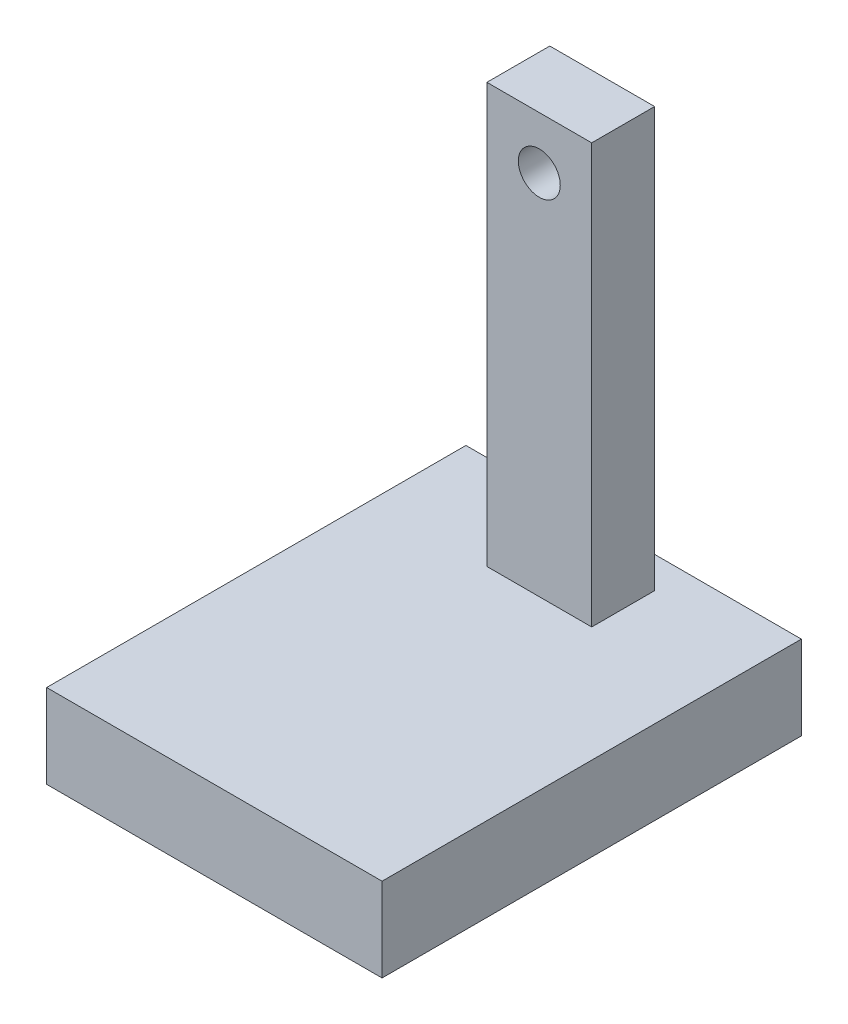
ISO-10303-21;
HEADER;
FILE_DESCRIPTION(('STEP AP214'),'2;1');
FILE_NAME('part.step','',(''),(''),'','','');
FILE_SCHEMA(('AUTOMOTIVE_DESIGN { 1 0 10303 214 1 1 1 1 }'));
ENDSEC;
DATA;
#1=APPLICATION_CONTEXT('core data for automotive mechanical design processes');
#2=APPLICATION_PROTOCOL_DEFINITION('international standard','automotive_design',2000,#1);
#3=PRODUCT_CONTEXT('',#1,'mechanical');
#4=PRODUCT('Part','Part','',(#3));
#5=PRODUCT_RELATED_PRODUCT_CATEGORY('part','',(#4));
#6=PRODUCT_DEFINITION_FORMATION('','',#4);
#7=PRODUCT_DEFINITION_CONTEXT('part definition',#1,'design');
#8=PRODUCT_DEFINITION('design','',#6,#7);
#9=PRODUCT_DEFINITION_SHAPE('','',#8);
#10=(LENGTH_UNIT() NAMED_UNIT(*) SI_UNIT(.MILLI.,.METRE.));
#11=(NAMED_UNIT(*) PLANE_ANGLE_UNIT() SI_UNIT($,.RADIAN.));
#12=(NAMED_UNIT(*) SI_UNIT($,.STERADIAN.) SOLID_ANGLE_UNIT());
#13=UNCERTAINTY_MEASURE_WITH_UNIT(LENGTH_MEASURE(1.E-05),#10,'distance_accuracy_value','');
#14=(GEOMETRIC_REPRESENTATION_CONTEXT(3) GLOBAL_UNCERTAINTY_ASSIGNED_CONTEXT((#13)) GLOBAL_UNIT_ASSIGNED_CONTEXT((#10,
#11,#12)) REPRESENTATION_CONTEXT('',''));
#15=CARTESIAN_POINT('',(0.,0.,0.));
#16=DIRECTION('',(0.,0.,1.));
#17=DIRECTION('',(1.,0.,0.));
#18=AXIS2_PLACEMENT_3D('',#15,#16,#17);
#19=CARTESIAN_POINT('',(40.,20.,-50.));
#20=DIRECTION('',(-1.,0.,0.));
#21=DIRECTION('',(0.,0.,1.));
#22=AXIS2_PLACEMENT_3D('',#19,#20,#21);
#23=PLANE('',#22);
#24=DIRECTION('',(0.,0.,-1.));
#25=VECTOR('',#24,1.);
#26=CARTESIAN_POINT('',(40.,0.,-50.));
#27=LINE('',#26,#25);
#28=CARTESIAN_POINT('',(40.,0.,50.));
#29=VERTEX_POINT('',#28);
#30=CARTESIAN_POINT('',(40.,0.,-50.));
#31=VERTEX_POINT('',#30);
#32=EDGE_CURVE('E363',#29,#31,#27,.T.);
#33=ORIENTED_EDGE('',*,*,#32,.T.);
#34=DIRECTION('',(0.,-1.,0.));
#35=VECTOR('',#34,1.);
#36=CARTESIAN_POINT('',(40.,20.,-50.));
#37=LINE('',#36,#35);
#38=CARTESIAN_POINT('',(40.,20.,-50.));
#39=VERTEX_POINT('',#38);
#40=EDGE_CURVE('E11',#39,#31,#37,.T.);
#41=ORIENTED_EDGE('',*,*,#40,.F.);
#42=DIRECTION('',(0.,0.,-1.));
#43=VECTOR('',#42,1.);
#44=CARTESIAN_POINT('',(40.,20.,-50.));
#45=LINE('',#44,#43);
#46=CARTESIAN_POINT('',(40.,20.,50.));
#47=VERTEX_POINT('',#46);
#48=EDGE_CURVE('E364',#47,#39,#45,.T.);
#49=ORIENTED_EDGE('',*,*,#48,.F.);
#50=DIRECTION('',(0.,-1.,0.));
#51=VECTOR('',#50,1.);
#52=CARTESIAN_POINT('',(40.,20.,50.));
#53=LINE('',#52,#51);
#54=EDGE_CURVE('E374',#47,#29,#53,.T.);
#55=ORIENTED_EDGE('',*,*,#54,.T.);
#56=EDGE_LOOP('',(#33,#41,#49,#55));
#57=FACE_BOUND('',#56,.T.);
#58=ADVANCED_FACE('F39',(#57),#23,.F.);
#59=CARTESIAN_POINT('',(-40.,20.,-50.));
#60=DIRECTION('',(0.,0.,1.));
#61=DIRECTION('',(1.,0.,0.));
#62=AXIS2_PLACEMENT_3D('',#59,#60,#61);
#63=PLANE('',#62);
#64=DIRECTION('',(-1.,0.,0.));
#65=VECTOR('',#64,1.);
#66=CARTESIAN_POINT('',(-40.,0.,-50.));
#67=LINE('',#66,#65);
#68=CARTESIAN_POINT('',(-40.,0.,-50.));
#69=VERTEX_POINT('',#68);
#70=EDGE_CURVE('E377',#31,#69,#67,.T.);
#71=ORIENTED_EDGE('',*,*,#70,.T.);
#72=DIRECTION('',(0.,-1.,0.));
#73=VECTOR('',#72,1.);
#74=CARTESIAN_POINT('',(-40.,20.,-50.));
#75=LINE('',#74,#73);
#76=CARTESIAN_POINT('',(-40.,20.,-50.));
#77=VERTEX_POINT('',#76);
#78=EDGE_CURVE('E46',#77,#69,#75,.T.);
#79=ORIENTED_EDGE('',*,*,#78,.F.);
#80=DIRECTION('',(-1.,0.,0.));
#81=VECTOR('',#80,1.);
#82=CARTESIAN_POINT('',(-40.,20.,-50.));
#83=LINE('',#82,#81);
#84=EDGE_CURVE('E367',#39,#77,#83,.T.);
#85=ORIENTED_EDGE('',*,*,#84,.F.);
#86=ORIENTED_EDGE('',*,*,#40,.T.);
#87=EDGE_LOOP('',(#71,#79,#85,#86));
#88=FACE_BOUND('',#87,.T.);
#89=ADVANCED_FACE('F407',(#88),#63,.F.);
#90=CARTESIAN_POINT('',(-40.,20.,-50.));
#91=DIRECTION('',(1.,0.,0.));
#92=DIRECTION('',(0.,0.,-1.));
#93=AXIS2_PLACEMENT_3D('',#90,#91,#92);
#94=PLANE('',#93);
#95=DIRECTION('',(0.,0.,1.));
#96=VECTOR('',#95,1.);
#97=CARTESIAN_POINT('',(-40.,0.,-50.));
#98=LINE('',#97,#96);
#99=CARTESIAN_POINT('',(-40.,0.,50.));
#100=VERTEX_POINT('',#99);
#101=EDGE_CURVE('E379',#69,#100,#98,.T.);
#102=ORIENTED_EDGE('',*,*,#101,.T.);
#103=DIRECTION('',(0.,-1.,0.));
#104=VECTOR('',#103,1.);
#105=CARTESIAN_POINT('',(-40.,20.,50.));
#106=LINE('',#105,#104);
#107=CARTESIAN_POINT('',(-40.,20.,50.));
#108=VERTEX_POINT('',#107);
#109=EDGE_CURVE('E384',#108,#100,#106,.T.);
#110=ORIENTED_EDGE('',*,*,#109,.F.);
#111=DIRECTION('',(0.,0.,1.));
#112=VECTOR('',#111,1.);
#113=CARTESIAN_POINT('',(-40.,20.,-50.));
#114=LINE('',#113,#112);
#115=EDGE_CURVE('E370',#77,#108,#114,.T.);
#116=ORIENTED_EDGE('',*,*,#115,.F.);
#117=ORIENTED_EDGE('',*,*,#78,.T.);
#118=EDGE_LOOP('',(#102,#110,#116,#117));
#119=FACE_BOUND('',#118,.T.);
#120=ADVANCED_FACE('F391',(#119),#94,.F.);
#121=CARTESIAN_POINT('',(-40.,20.,50.));
#122=DIRECTION('',(0.,0.,-1.));
#123=DIRECTION('',(-1.,0.,0.));
#124=AXIS2_PLACEMENT_3D('',#121,#122,#123);
#125=PLANE('',#124);
#126=DIRECTION('',(1.,0.,0.));
#127=VECTOR('',#126,1.);
#128=CARTESIAN_POINT('',(-40.,0.,50.));
#129=LINE('',#128,#127);
#130=EDGE_CURVE('E368',#100,#29,#129,.T.);
#131=ORIENTED_EDGE('',*,*,#130,.T.);
#132=ORIENTED_EDGE('',*,*,#54,.F.);
#133=DIRECTION('',(1.,0.,0.));
#134=VECTOR('',#133,1.);
#135=CARTESIAN_POINT('',(-40.,20.,50.));
#136=LINE('',#135,#134);
#137=EDGE_CURVE('E372',#108,#47,#136,.T.);
#138=ORIENTED_EDGE('',*,*,#137,.F.);
#139=ORIENTED_EDGE('',*,*,#109,.T.);
#140=EDGE_LOOP('',(#131,#132,#138,#139));
#141=FACE_BOUND('',#140,.T.);
#142=ADVANCED_FACE('F400',(#141),#125,.F.);
#143=CARTESIAN_POINT('',(0.,20.,0.));
#144=DIRECTION('',(0.,1.,0.));
#145=DIRECTION('',(0.,0.,1.));
#146=AXIS2_PLACEMENT_3D('',#143,#144,#145);
#147=PLANE('',#146);
#148=DIRECTION('',(0.,0.,1.));
#149=VECTOR('',#148,1.);
#150=CARTESIAN_POINT('',(12.5,20.,0.));
#151=LINE('',#150,#149);
#152=CARTESIAN_POINT('',(12.5,20.,-42.5));
#153=VERTEX_POINT('',#152);
#154=CARTESIAN_POINT('',(12.5,20.,-27.5));
#155=VERTEX_POINT('',#154);
#156=EDGE_CURVE('E331',#153,#155,#151,.T.);
#157=ORIENTED_EDGE('',*,*,#156,.T.);
#158=DIRECTION('',(1.,0.,0.));
#159=VECTOR('',#158,1.);
#160=CARTESIAN_POINT('',(0.,20.,-27.5));
#161=LINE('',#160,#159);
#162=CARTESIAN_POINT('',(-12.5,20.,-27.5));
#163=VERTEX_POINT('',#162);
#164=EDGE_CURVE('E338',#163,#155,#161,.T.);
#165=ORIENTED_EDGE('',*,*,#164,.F.);
#166=DIRECTION('',(0.,0.,1.));
#167=VECTOR('',#166,1.);
#168=CARTESIAN_POINT('',(-12.5,20.,0.));
#169=LINE('',#168,#167);
#170=CARTESIAN_POINT('',(-12.5,20.,-42.5));
#171=VERTEX_POINT('',#170);
#172=EDGE_CURVE('E351',#171,#163,#169,.T.);
#173=ORIENTED_EDGE('',*,*,#172,.F.);
#174=DIRECTION('',(1.,0.,0.));
#175=VECTOR('',#174,1.);
#176=CARTESIAN_POINT('',(0.,20.,-42.5));
#177=LINE('',#176,#175);
#178=EDGE_CURVE('E348',#171,#153,#177,.T.);
#179=ORIENTED_EDGE('',*,*,#178,.T.);
#180=EDGE_LOOP('',(#157,#165,#173,#179));
#181=FACE_BOUND('',#180,.T.);
#182=ORIENTED_EDGE('',*,*,#48,.T.);
#183=ORIENTED_EDGE('',*,*,#84,.T.);
#184=ORIENTED_EDGE('',*,*,#115,.T.);
#185=ORIENTED_EDGE('',*,*,#137,.T.);
#186=EDGE_LOOP('',(#182,#183,#184,#185));
#187=FACE_BOUND('',#186,.T.);
#188=ADVANCED_FACE('F406',(#181,#187),#147,.T.);
#189=CARTESIAN_POINT('',(0.,0.,0.));
#190=DIRECTION('',(0.,1.,0.));
#191=DIRECTION('',(0.,0.,1.));
#192=AXIS2_PLACEMENT_3D('',#189,#190,#191);
#193=PLANE('',#192);
#194=DIRECTION('',(1.,0.,0.));
#195=VECTOR('',#194,1.);
#196=CARTESIAN_POINT('',(0.,0.,-25.));
#197=LINE('',#196,#195);
#198=CARTESIAN_POINT('',(-35.,0.,-25.));
#199=VERTEX_POINT('',#198);
#200=CARTESIAN_POINT('',(-15.,0.,-25.));
#201=VERTEX_POINT('',#200);
#202=EDGE_CURVE('E53',#199,#201,#197,.T.);
#203=ORIENTED_EDGE('',*,*,#202,.T.);
#204=DIRECTION('',(0.,0.,-1.));
#205=VECTOR('',#204,1.);
#206=CARTESIAN_POINT('',(-15.,0.,0.));
#207=LINE('',#206,#205);
#208=CARTESIAN_POINT('',(-15.,0.,-45.));
#209=VERTEX_POINT('',#208);
#210=EDGE_CURVE('E203',#201,#209,#207,.T.);
#211=ORIENTED_EDGE('',*,*,#210,.T.);
#212=DIRECTION('',(1.,0.,0.));
#213=VECTOR('',#212,1.);
#214=CARTESIAN_POINT('',(0.,0.,-45.));
#215=LINE('',#214,#213);
#216=CARTESIAN_POINT('',(-35.,0.,-45.));
#217=VERTEX_POINT('',#216);
#218=EDGE_CURVE('E216',#217,#209,#215,.T.);
#219=ORIENTED_EDGE('',*,*,#218,.F.);
#220=DIRECTION('',(0.,0.,-1.));
#221=VECTOR('',#220,1.);
#222=CARTESIAN_POINT('',(-35.,0.,0.));
#223=LINE('',#222,#221);
#224=EDGE_CURVE('E58',#199,#217,#223,.T.);
#225=ORIENTED_EDGE('',*,*,#224,.F.);
#226=EDGE_LOOP('',(#203,#211,#219,#225));
#227=FACE_BOUND('',#226,.T.);
#228=DIRECTION('',(-1.,0.,0.));
#229=VECTOR('',#228,1.);
#230=CARTESIAN_POINT('',(0.,0.,-25.));
#231=LINE('',#230,#229);
#232=CARTESIAN_POINT('',(35.,0.,-25.));
#233=VERTEX_POINT('',#232);
#234=CARTESIAN_POINT('',(15.,0.,-25.));
#235=VERTEX_POINT('',#234);
#236=EDGE_CURVE('E250',#233,#235,#231,.T.);
#237=ORIENTED_EDGE('',*,*,#236,.F.);
#238=DIRECTION('',(0.,0.,-1.));
#239=VECTOR('',#238,1.);
#240=CARTESIAN_POINT('',(35.,0.,0.));
#241=LINE('',#240,#239);
#242=CARTESIAN_POINT('',(35.,0.,-45.));
#243=VERTEX_POINT('',#242);
#244=EDGE_CURVE('E206',#233,#243,#241,.T.);
#245=ORIENTED_EDGE('',*,*,#244,.T.);
#246=DIRECTION('',(-1.,0.,0.));
#247=VECTOR('',#246,1.);
#248=CARTESIAN_POINT('',(0.,0.,-45.));
#249=LINE('',#248,#247);
#250=CARTESIAN_POINT('',(15.,0.,-45.));
#251=VERTEX_POINT('',#250);
#252=EDGE_CURVE('E240',#243,#251,#249,.T.);
#253=ORIENTED_EDGE('',*,*,#252,.T.);
#254=DIRECTION('',(0.,0.,-1.));
#255=VECTOR('',#254,1.);
#256=CARTESIAN_POINT('',(15.,0.,0.));
#257=LINE('',#256,#255);
#258=EDGE_CURVE('E252',#235,#251,#257,.T.);
#259=ORIENTED_EDGE('',*,*,#258,.F.);
#260=EDGE_LOOP('',(#237,#245,#253,#259));
#261=FACE_BOUND('',#260,.T.);
#262=DIRECTION('',(-1.,0.,0.));
#263=VECTOR('',#262,1.);
#264=CARTESIAN_POINT('',(0.,0.,45.));
#265=LINE('',#264,#263);
#266=CARTESIAN_POINT('',(35.,0.,45.));
#267=VERTEX_POINT('',#266);
#268=CARTESIAN_POINT('',(15.,0.,45.));
#269=VERTEX_POINT('',#268);
#270=EDGE_CURVE('E280',#267,#269,#265,.T.);
#271=ORIENTED_EDGE('',*,*,#270,.F.);
#272=DIRECTION('',(0.,0.,-1.));
#273=VECTOR('',#272,1.);
#274=CARTESIAN_POINT('',(35.,0.,0.));
#275=LINE('',#274,#273);
#276=CARTESIAN_POINT('',(35.,0.,25.));
#277=VERTEX_POINT('',#276);
#278=EDGE_CURVE('E265',#267,#277,#275,.T.);
#279=ORIENTED_EDGE('',*,*,#278,.T.);
#280=DIRECTION('',(-1.,0.,0.));
#281=VECTOR('',#280,1.);
#282=CARTESIAN_POINT('',(0.,0.,25.));
#283=LINE('',#282,#281);
#284=CARTESIAN_POINT('',(15.,0.,25.));
#285=VERTEX_POINT('',#284);
#286=EDGE_CURVE('E270',#277,#285,#283,.T.);
#287=ORIENTED_EDGE('',*,*,#286,.T.);
#288=DIRECTION('',(0.,0.,-1.));
#289=VECTOR('',#288,1.);
#290=CARTESIAN_POINT('',(15.,0.,0.));
#291=LINE('',#290,#289);
#292=EDGE_CURVE('E282',#269,#285,#291,.T.);
#293=ORIENTED_EDGE('',*,*,#292,.F.);
#294=EDGE_LOOP('',(#271,#279,#287,#293));
#295=FACE_BOUND('',#294,.T.);
#296=DIRECTION('',(1.,0.,0.));
#297=VECTOR('',#296,1.);
#298=CARTESIAN_POINT('',(0.,0.,45.));
#299=LINE('',#298,#297);
#300=CARTESIAN_POINT('',(-35.,0.,45.));
#301=VERTEX_POINT('',#300);
#302=CARTESIAN_POINT('',(-15.,0.,45.));
#303=VERTEX_POINT('',#302);
#304=EDGE_CURVE('E309',#301,#303,#299,.T.);
#305=ORIENTED_EDGE('',*,*,#304,.T.);
#306=DIRECTION('',(0.,0.,-1.));
#307=VECTOR('',#306,1.);
#308=CARTESIAN_POINT('',(-15.,0.,0.));
#309=LINE('',#308,#307);
#310=CARTESIAN_POINT('',(-15.,0.,25.));
#311=VERTEX_POINT('',#310);
#312=EDGE_CURVE('E295',#303,#311,#309,.T.);
#313=ORIENTED_EDGE('',*,*,#312,.T.);
#314=DIRECTION('',(1.,0.,0.));
#315=VECTOR('',#314,1.);
#316=CARTESIAN_POINT('',(0.,0.,25.));
#317=LINE('',#316,#315);
#318=CARTESIAN_POINT('',(-35.,0.,25.));
#319=VERTEX_POINT('',#318);
#320=EDGE_CURVE('E300',#319,#311,#317,.T.);
#321=ORIENTED_EDGE('',*,*,#320,.F.);
#322=DIRECTION('',(0.,0.,-1.));
#323=VECTOR('',#322,1.);
#324=CARTESIAN_POINT('',(-35.,0.,0.));
#325=LINE('',#324,#323);
#326=EDGE_CURVE('E311',#301,#319,#325,.T.);
#327=ORIENTED_EDGE('',*,*,#326,.F.);
#328=EDGE_LOOP('',(#305,#313,#321,#327));
#329=FACE_BOUND('',#328,.T.);
#330=ORIENTED_EDGE('',*,*,#32,.F.);
#331=ORIENTED_EDGE('',*,*,#130,.F.);
#332=ORIENTED_EDGE('',*,*,#101,.F.);
#333=ORIENTED_EDGE('',*,*,#70,.F.);
#334=EDGE_LOOP('',(#330,#331,#332,#333));
#335=FACE_BOUND('',#334,.T.);
#336=ADVANCED_FACE('F397',(#227,#261,#295,#329,#335),#193,.F.);
#337=CARTESIAN_POINT('',(12.5,120.,0.));
#338=DIRECTION('',(1.,0.,0.));
#339=DIRECTION('',(0.,0.,-1.));
#340=AXIS2_PLACEMENT_3D('',#337,#338,#339);
#341=PLANE('',#340);
#342=ORIENTED_EDGE('',*,*,#156,.F.);
#343=DIRECTION('',(0.,-1.,0.));
#344=VECTOR('',#343,1.);
#345=CARTESIAN_POINT('',(12.5,120.,-42.5));
#346=LINE('',#345,#344);
#347=CARTESIAN_POINT('',(12.5,120.,-42.5));
#348=VERTEX_POINT('',#347);
#349=EDGE_CURVE('E361',#348,#153,#346,.T.);
#350=ORIENTED_EDGE('',*,*,#349,.F.);
#351=DIRECTION('',(0.,0.,1.));
#352=VECTOR('',#351,1.);
#353=CARTESIAN_POINT('',(12.5,120.,0.));
#354=LINE('',#353,#352);
#355=CARTESIAN_POINT('',(12.5,120.,-27.5));
#356=VERTEX_POINT('',#355);
#357=EDGE_CURVE('E334',#348,#356,#354,.T.);
#358=ORIENTED_EDGE('',*,*,#357,.T.);
#359=DIRECTION('',(0.,-1.,0.));
#360=VECTOR('',#359,1.);
#361=CARTESIAN_POINT('',(12.5,120.,-27.5));
#362=LINE('',#361,#360);
#363=EDGE_CURVE('E345',#356,#155,#362,.T.);
#364=ORIENTED_EDGE('',*,*,#363,.T.);
#365=EDGE_LOOP('',(#342,#350,#358,#364));
#366=FACE_BOUND('',#365,.T.);
#367=ADVANCED_FACE('F419',(#366),#341,.T.);
#368=CARTESIAN_POINT('',(0.,120.,-42.5));
#369=DIRECTION('',(0.,0.,-1.));
#370=DIRECTION('',(-1.,0.,0.));
#371=AXIS2_PLACEMENT_3D('',#368,#369,#370);
#372=PLANE('',#371);
#373=CARTESIAN_POINT('',(0.,107.5,-42.5));
#374=DIRECTION('',(0.,0.,-1.));
#375=DIRECTION('',(-1.,0.,0.));
#376=AXIS2_PLACEMENT_3D('',#373,#374,#375);
#377=CIRCLE('',#376,5.);
#378=CARTESIAN_POINT('',(5.00000000000001,107.5,-42.5));
#379=VERTEX_POINT('',#378);
#380=EDGE_CURVE('E327',#379,#379,#377,.F.);
#381=ORIENTED_EDGE('',*,*,#380,.T.);
#382=EDGE_LOOP('',(#381));
#383=FACE_BOUND('',#382,.T.);
#384=ORIENTED_EDGE('',*,*,#178,.F.);
#385=DIRECTION('',(0.,-1.,0.));
#386=VECTOR('',#385,1.);
#387=CARTESIAN_POINT('',(-12.5,120.,-42.5));
#388=LINE('',#387,#386);
#389=CARTESIAN_POINT('',(-12.5,120.,-42.5));
#390=VERTEX_POINT('',#389);
#391=EDGE_CURVE('E359',#390,#171,#388,.T.);
#392=ORIENTED_EDGE('',*,*,#391,.F.);
#393=DIRECTION('',(1.,0.,0.));
#394=VECTOR('',#393,1.);
#395=CARTESIAN_POINT('',(0.,120.,-42.5));
#396=LINE('',#395,#394);
#397=EDGE_CURVE('E337',#390,#348,#396,.T.);
#398=ORIENTED_EDGE('',*,*,#397,.T.);
#399=ORIENTED_EDGE('',*,*,#349,.T.);
#400=EDGE_LOOP('',(#384,#392,#398,#399));
#401=FACE_BOUND('',#400,.T.);
#402=ADVANCED_FACE('F425',(#383,#401),#372,.T.);
#403=CARTESIAN_POINT('',(-12.5,120.,0.));
#404=DIRECTION('',(1.,0.,0.));
#405=DIRECTION('',(0.,0.,-1.));
#406=AXIS2_PLACEMENT_3D('',#403,#404,#405);
#407=PLANE('',#406);
#408=ORIENTED_EDGE('',*,*,#172,.T.);
#409=DIRECTION('',(0.,-1.,0.));
#410=VECTOR('',#409,1.);
#411=CARTESIAN_POINT('',(-12.5,120.,-27.5));
#412=LINE('',#411,#410);
#413=CARTESIAN_POINT('',(-12.5,120.,-27.5));
#414=VERTEX_POINT('',#413);
#415=EDGE_CURVE('E357',#414,#163,#412,.T.);
#416=ORIENTED_EDGE('',*,*,#415,.F.);
#417=DIRECTION('',(0.,0.,1.));
#418=VECTOR('',#417,1.);
#419=CARTESIAN_POINT('',(-12.5,120.,0.));
#420=LINE('',#419,#418);
#421=EDGE_CURVE('E341',#390,#414,#420,.T.);
#422=ORIENTED_EDGE('',*,*,#421,.F.);
#423=ORIENTED_EDGE('',*,*,#391,.T.);
#424=EDGE_LOOP('',(#408,#416,#422,#423));
#425=FACE_BOUND('',#424,.T.);
#426=ADVANCED_FACE('F429',(#425),#407,.F.);
#427=CARTESIAN_POINT('',(0.,120.,-27.5));
#428=DIRECTION('',(0.,0.,-1.));
#429=DIRECTION('',(-1.,0.,0.));
#430=AXIS2_PLACEMENT_3D('',#427,#428,#429);
#431=PLANE('',#430);
#432=CARTESIAN_POINT('',(0.,107.5,-27.5));
#433=DIRECTION('',(0.,0.,1.));
#434=DIRECTION('',(1.,0.,0.));
#435=AXIS2_PLACEMENT_3D('',#432,#433,#434);
#436=CIRCLE('',#435,5.);
#437=CARTESIAN_POINT('',(5.00000000000001,107.5,-27.5));
#438=VERTEX_POINT('',#437);
#439=EDGE_CURVE('E328',#438,#438,#436,.T.);
#440=ORIENTED_EDGE('',*,*,#439,.F.);
#441=EDGE_LOOP('',(#440));
#442=FACE_BOUND('',#441,.T.);
#443=ORIENTED_EDGE('',*,*,#164,.T.);
#444=ORIENTED_EDGE('',*,*,#363,.F.);
#445=DIRECTION('',(1.,0.,0.));
#446=VECTOR('',#445,1.);
#447=CARTESIAN_POINT('',(0.,120.,-27.5));
#448=LINE('',#447,#446);
#449=EDGE_CURVE('E343',#414,#356,#448,.T.);
#450=ORIENTED_EDGE('',*,*,#449,.F.);
#451=ORIENTED_EDGE('',*,*,#415,.T.);
#452=EDGE_LOOP('',(#443,#444,#450,#451));
#453=FACE_BOUND('',#452,.T.);
#454=ADVANCED_FACE('F433',(#442,#453),#431,.F.);
#455=CARTESIAN_POINT('',(0.,120.,0.));
#456=DIRECTION('',(0.,1.,0.));
#457=DIRECTION('',(0.,0.,1.));
#458=AXIS2_PLACEMENT_3D('',#455,#456,#457);
#459=PLANE('',#458);
#460=ORIENTED_EDGE('',*,*,#357,.F.);
#461=ORIENTED_EDGE('',*,*,#397,.F.);
#462=ORIENTED_EDGE('',*,*,#421,.T.);
#463=ORIENTED_EDGE('',*,*,#449,.T.);
#464=EDGE_LOOP('',(#460,#461,#462,#463));
#465=FACE_BOUND('',#464,.T.);
#466=ADVANCED_FACE('F437',(#465),#459,.T.);
#467=CARTESIAN_POINT('',(0.,107.5,-50.001));
#468=DIRECTION('',(0.,0.,1.));
#469=DIRECTION('',(1.,0.,0.));
#470=AXIS2_PLACEMENT_3D('',#467,#468,#469);
#471=CYLINDRICAL_SURFACE('',#470,5.);
#472=CARTESIAN_POINT('',(5.00000000000001,107.5,-42.5));
#473=CARTESIAN_POINT('',(5.00000000000001,107.5,-42.34375));
#474=CARTESIAN_POINT('',(5.00000000000001,107.5,-42.1875));
#475=CARTESIAN_POINT('',(5.00000000000001,107.5,-41.875));
#476=CARTESIAN_POINT('',(5.00000000000001,107.5,-41.71875));
#477=CARTESIAN_POINT('',(5.00000000000001,107.5,-41.40625));
#478=CARTESIAN_POINT('',(5.00000000000001,107.5,-41.25));
#479=CARTESIAN_POINT('',(5.00000000000001,107.5,-40.9375));
#480=CARTESIAN_POINT('',(5.00000000000001,107.5,-40.78125));
#481=CARTESIAN_POINT('',(5.00000000000001,107.5,-40.46875));
#482=CARTESIAN_POINT('',(5.00000000000001,107.5,-40.3125));
#483=CARTESIAN_POINT('',(5.00000000000001,107.5,-40.));
#484=CARTESIAN_POINT('',(5.00000000000001,107.5,-39.84375));
#485=CARTESIAN_POINT('',(5.00000000000001,107.5,-39.53125));
#486=CARTESIAN_POINT('',(5.00000000000001,107.5,-39.375));
#487=CARTESIAN_POINT('',(5.00000000000001,107.5,-39.0625));
#488=CARTESIAN_POINT('',(5.00000000000001,107.5,-38.90625));
#489=CARTESIAN_POINT('',(5.00000000000001,107.5,-38.59375));
#490=CARTESIAN_POINT('',(5.00000000000001,107.5,-38.4375));
#491=CARTESIAN_POINT('',(5.00000000000001,107.5,-38.125));
#492=CARTESIAN_POINT('',(5.00000000000001,107.5,-37.96875));
#493=CARTESIAN_POINT('',(5.00000000000001,107.5,-37.65625));
#494=CARTESIAN_POINT('',(5.00000000000001,107.5,-37.5));
#495=CARTESIAN_POINT('',(5.00000000000001,107.5,-37.1875));
#496=CARTESIAN_POINT('',(5.00000000000001,107.5,-37.03125));
#497=CARTESIAN_POINT('',(5.00000000000001,107.5,-36.71875));
#498=CARTESIAN_POINT('',(5.00000000000001,107.5,-36.5625));
#499=CARTESIAN_POINT('',(5.00000000000001,107.5,-36.25));
#500=CARTESIAN_POINT('',(5.00000000000001,107.5,-36.09375));
#501=CARTESIAN_POINT('',(5.00000000000001,107.5,-35.78125));
#502=CARTESIAN_POINT('',(5.00000000000001,107.5,-35.625));
#503=CARTESIAN_POINT('',(5.00000000000001,107.5,-35.3125));
#504=CARTESIAN_POINT('',(5.00000000000001,107.5,-35.15625));
#505=CARTESIAN_POINT('',(5.00000000000001,107.5,-34.84375));
#506=CARTESIAN_POINT('',(5.00000000000001,107.5,-34.6875));
#507=CARTESIAN_POINT('',(5.00000000000001,107.5,-34.375));
#508=CARTESIAN_POINT('',(5.00000000000001,107.5,-34.21875));
#509=CARTESIAN_POINT('',(5.00000000000001,107.5,-33.90625));
#510=CARTESIAN_POINT('',(5.00000000000001,107.5,-33.75));
#511=CARTESIAN_POINT('',(5.00000000000001,107.5,-33.4375));
#512=CARTESIAN_POINT('',(5.00000000000001,107.5,-33.28125));
#513=CARTESIAN_POINT('',(5.00000000000001,107.5,-32.96875));
#514=CARTESIAN_POINT('',(5.00000000000001,107.5,-32.8125));
#515=CARTESIAN_POINT('',(5.00000000000001,107.5,-32.5));
#516=CARTESIAN_POINT('',(5.00000000000001,107.5,-32.34375));
#517=CARTESIAN_POINT('',(5.00000000000001,107.5,-32.03125));
#518=CARTESIAN_POINT('',(5.00000000000001,107.5,-31.875));
#519=CARTESIAN_POINT('',(5.00000000000001,107.5,-31.5625));
#520=CARTESIAN_POINT('',(5.00000000000001,107.5,-31.40625));
#521=CARTESIAN_POINT('',(5.00000000000001,107.5,-31.09375));
#522=CARTESIAN_POINT('',(5.00000000000001,107.5,-30.9375));
#523=CARTESIAN_POINT('',(5.00000000000001,107.5,-30.625));
#524=CARTESIAN_POINT('',(5.00000000000001,107.5,-30.46875));
#525=CARTESIAN_POINT('',(5.00000000000001,107.5,-30.15625));
#526=CARTESIAN_POINT('',(5.00000000000001,107.5,-30.));
#527=CARTESIAN_POINT('',(5.00000000000001,107.5,-29.6875));
#528=CARTESIAN_POINT('',(5.00000000000001,107.5,-29.53125));
#529=CARTESIAN_POINT('',(5.00000000000001,107.5,-29.21875));
#530=CARTESIAN_POINT('',(5.00000000000001,107.5,-29.0625));
#531=CARTESIAN_POINT('',(5.00000000000001,107.5,-28.75));
#532=CARTESIAN_POINT('',(5.00000000000001,107.5,-28.59375));
#533=CARTESIAN_POINT('',(5.00000000000001,107.5,-28.28125));
#534=CARTESIAN_POINT('',(5.00000000000001,107.5,-28.125));
#535=CARTESIAN_POINT('',(5.00000000000001,107.5,-27.8125));
#536=CARTESIAN_POINT('',(5.00000000000001,107.5,-27.65625));
#537=CARTESIAN_POINT('',(5.00000000000001,107.5,-27.5));
#538=B_SPLINE_CURVE_WITH_KNOTS('',3,(#472,#473,#474,#475,#476,#477,#478,#479,#480,#481,#482,
#483,#484,#485,#486,#487,#488,#489,#490,#491,#492,#493,#494,#495,#496,#497,#498,#499,#500,#501,
#502,#503,#504,#505,#506,#507,#508,#509,#510,#511,#512,#513,#514,#515,#516,#517,#518,#519,#520,
#521,#522,#523,#524,#525,#526,#527,#528,#529,#530,#531,#532,#533,#534,#535,#536,#537),
.UNSPECIFIED.,.F.,.F.,(4,2,2,2,2,2,2,2,2,2,2,2,2,2,2,2,2,2,2,2,2,2,2,2,2,2,2,2,2,2,2,2,4),(0.,
0.468750000000004,0.937500000000001,1.40625,1.875,2.34375,2.8125,3.28125,3.75,4.21875,4.6875,
5.15625,5.625,6.09375,6.5625,7.03125,7.5,7.96875,8.43749999999999,8.90625,9.375,
9.84374999999999,10.3125,10.78125,11.25,11.71875,12.1875,12.65625,13.125,13.59375,14.0625,
14.53125,15.),.UNSPECIFIED.);
#539=EDGE_CURVE('BSEAM441',#379,#438,#538,.T.);
#540=ORIENTED_EDGE('',*,*,#380,.F.);
#541=ORIENTED_EDGE('',*,*,#439,.T.);
#542=ORIENTED_EDGE('',*,*,#539,.T.);
#543=ORIENTED_EDGE('',*,*,#539,.F.);
#544=EDGE_LOOP('',(#540,#542,#541,#543));
#545=FACE_BOUND('',#544,.T.);
#546=ADVANCED_FACE('F441',(#545),#471,.F.);
#547=CARTESIAN_POINT('',(-15.,-5.,0.));
#548=DIRECTION('',(1.,0.,0.));
#549=DIRECTION('',(0.,0.,-1.));
#550=AXIS2_PLACEMENT_3D('',#547,#548,#549);
#551=PLANE('',#550);
#552=ORIENTED_EDGE('',*,*,#312,.F.);
#553=DIRECTION('',(0.,1.,0.));
#554=VECTOR('',#553,1.);
#555=CARTESIAN_POINT('',(-15.,-5.,45.));
#556=LINE('',#555,#554);
#557=CARTESIAN_POINT('',(-15.,-5.,45.));
#558=VERTEX_POINT('',#557);
#559=EDGE_CURVE('E324',#558,#303,#556,.T.);
#560=ORIENTED_EDGE('',*,*,#559,.F.);
#561=DIRECTION('',(0.,0.,-1.));
#562=VECTOR('',#561,1.);
#563=CARTESIAN_POINT('',(-15.,-5.,0.));
#564=LINE('',#563,#562);
#565=CARTESIAN_POINT('',(-15.,-5.,25.));
#566=VERTEX_POINT('',#565);
#567=EDGE_CURVE('E296',#558,#566,#564,.T.);
#568=ORIENTED_EDGE('',*,*,#567,.T.);
#569=DIRECTION('',(0.,1.,0.));
#570=VECTOR('',#569,1.);
#571=CARTESIAN_POINT('',(-15.,-5.,25.));
#572=LINE('',#571,#570);
#573=EDGE_CURVE('E307',#566,#311,#572,.T.);
#574=ORIENTED_EDGE('',*,*,#573,.T.);
#575=EDGE_LOOP('',(#552,#560,#568,#574));
#576=FACE_BOUND('',#575,.T.);
#577=ADVANCED_FACE('F445',(#576),#551,.T.);
#578=CARTESIAN_POINT('',(0.,-5.,45.));
#579=DIRECTION('',(0.,0.,1.));
#580=DIRECTION('',(1.,0.,0.));
#581=AXIS2_PLACEMENT_3D('',#578,#579,#580);
#582=PLANE('',#581);
#583=ORIENTED_EDGE('',*,*,#304,.F.);
#584=DIRECTION('',(0.,1.,0.));
#585=VECTOR('',#584,1.);
#586=CARTESIAN_POINT('',(-35.,-5.,45.));
#587=LINE('',#586,#585);
#588=CARTESIAN_POINT('',(-35.,-5.,45.));
#589=VERTEX_POINT('',#588);
#590=EDGE_CURVE('E321',#589,#301,#587,.T.);
#591=ORIENTED_EDGE('',*,*,#590,.F.);
#592=DIRECTION('',(1.,0.,0.));
#593=VECTOR('',#592,1.);
#594=CARTESIAN_POINT('',(0.,-5.,45.));
#595=LINE('',#594,#593);
#596=EDGE_CURVE('E299',#589,#558,#595,.T.);
#597=ORIENTED_EDGE('',*,*,#596,.T.);
#598=ORIENTED_EDGE('',*,*,#559,.T.);
#599=EDGE_LOOP('',(#583,#591,#597,#598));
#600=FACE_BOUND('',#599,.T.);
#601=ADVANCED_FACE('F449',(#600),#582,.T.);
#602=CARTESIAN_POINT('',(-35.,-5.,0.));
#603=DIRECTION('',(1.,0.,0.));
#604=DIRECTION('',(0.,0.,-1.));
#605=AXIS2_PLACEMENT_3D('',#602,#603,#604);
#606=PLANE('',#605);
#607=ORIENTED_EDGE('',*,*,#326,.T.);
#608=DIRECTION('',(0.,1.,0.));
#609=VECTOR('',#608,1.);
#610=CARTESIAN_POINT('',(-35.,-5.,25.));
#611=LINE('',#610,#609);
#612=CARTESIAN_POINT('',(-35.,-5.,25.));
#613=VERTEX_POINT('',#612);
#614=EDGE_CURVE('E318',#613,#319,#611,.T.);
#615=ORIENTED_EDGE('',*,*,#614,.F.);
#616=DIRECTION('',(0.,0.,-1.));
#617=VECTOR('',#616,1.);
#618=CARTESIAN_POINT('',(-35.,-5.,0.));
#619=LINE('',#618,#617);
#620=EDGE_CURVE('E303',#589,#613,#619,.T.);
#621=ORIENTED_EDGE('',*,*,#620,.F.);
#622=ORIENTED_EDGE('',*,*,#590,.T.);
#623=EDGE_LOOP('',(#607,#615,#621,#622));
#624=FACE_BOUND('',#623,.T.);
#625=ADVANCED_FACE('F453',(#624),#606,.F.);
#626=CARTESIAN_POINT('',(0.,-5.,25.));
#627=DIRECTION('',(0.,0.,1.));
#628=DIRECTION('',(1.,0.,0.));
#629=AXIS2_PLACEMENT_3D('',#626,#627,#628);
#630=PLANE('',#629);
#631=ORIENTED_EDGE('',*,*,#320,.T.);
#632=ORIENTED_EDGE('',*,*,#573,.F.);
#633=DIRECTION('',(1.,0.,0.));
#634=VECTOR('',#633,1.);
#635=CARTESIAN_POINT('',(0.,-5.,25.));
#636=LINE('',#635,#634);
#637=EDGE_CURVE('E305',#613,#566,#636,.T.);
#638=ORIENTED_EDGE('',*,*,#637,.F.);
#639=ORIENTED_EDGE('',*,*,#614,.T.);
#640=EDGE_LOOP('',(#631,#632,#638,#639));
#641=FACE_BOUND('',#640,.T.);
#642=ADVANCED_FACE('F457',(#641),#630,.F.);
#643=CARTESIAN_POINT('',(0.,-5.,0.));
#644=DIRECTION('',(0.,-1.,0.));
#645=DIRECTION('',(0.,0.,-1.));
#646=AXIS2_PLACEMENT_3D('',#643,#644,#645);
#647=PLANE('',#646);
#648=ORIENTED_EDGE('',*,*,#567,.F.);
#649=ORIENTED_EDGE('',*,*,#596,.F.);
#650=ORIENTED_EDGE('',*,*,#620,.T.);
#651=ORIENTED_EDGE('',*,*,#637,.T.);
#652=EDGE_LOOP('',(#648,#649,#650,#651));
#653=FACE_BOUND('',#652,.T.);
#654=ADVANCED_FACE('F461',(#653),#647,.T.);
#655=CARTESIAN_POINT('',(35.,-5.,0.));
#656=DIRECTION('',(1.,0.,0.));
#657=DIRECTION('',(0.,0.,-1.));
#658=AXIS2_PLACEMENT_3D('',#655,#656,#657);
#659=PLANE('',#658);
#660=ORIENTED_EDGE('',*,*,#278,.F.);
#661=DIRECTION('',(0.,1.,0.));
#662=VECTOR('',#661,1.);
#663=CARTESIAN_POINT('',(35.,-5.,45.));
#664=LINE('',#663,#662);
#665=CARTESIAN_POINT('',(35.,-5.,45.));
#666=VERTEX_POINT('',#665);
#667=EDGE_CURVE('E293',#666,#267,#664,.T.);
#668=ORIENTED_EDGE('',*,*,#667,.F.);
#669=DIRECTION('',(0.,0.,-1.));
#670=VECTOR('',#669,1.);
#671=CARTESIAN_POINT('',(35.,-5.,0.));
#672=LINE('',#671,#670);
#673=CARTESIAN_POINT('',(35.,-5.,25.));
#674=VERTEX_POINT('',#673);
#675=EDGE_CURVE('E266',#666,#674,#672,.T.);
#676=ORIENTED_EDGE('',*,*,#675,.T.);
#677=DIRECTION('',(0.,1.,0.));
#678=VECTOR('',#677,1.);
#679=CARTESIAN_POINT('',(35.,-5.,25.));
#680=LINE('',#679,#678);
#681=EDGE_CURVE('E277',#674,#277,#680,.T.);
#682=ORIENTED_EDGE('',*,*,#681,.T.);
#683=EDGE_LOOP('',(#660,#668,#676,#682));
#684=FACE_BOUND('',#683,.T.);
#685=ADVANCED_FACE('F465',(#684),#659,.T.);
#686=CARTESIAN_POINT('',(0.,-5.,45.));
#687=DIRECTION('',(0.,0.,-1.));
#688=DIRECTION('',(-1.,0.,0.));
#689=AXIS2_PLACEMENT_3D('',#686,#687,#688);
#690=PLANE('',#689);
#691=ORIENTED_EDGE('',*,*,#270,.T.);
#692=DIRECTION('',(0.,1.,0.));
#693=VECTOR('',#692,1.);
#694=CARTESIAN_POINT('',(15.,-5.,45.));
#695=LINE('',#694,#693);
#696=CARTESIAN_POINT('',(15.,-5.,45.));
#697=VERTEX_POINT('',#696);
#698=EDGE_CURVE('E290',#697,#269,#695,.T.);
#699=ORIENTED_EDGE('',*,*,#698,.F.);
#700=DIRECTION('',(-1.,0.,0.));
#701=VECTOR('',#700,1.);
#702=CARTESIAN_POINT('',(0.,-5.,45.));
#703=LINE('',#702,#701);
#704=EDGE_CURVE('E269',#666,#697,#703,.T.);
#705=ORIENTED_EDGE('',*,*,#704,.F.);
#706=ORIENTED_EDGE('',*,*,#667,.T.);
#707=EDGE_LOOP('',(#691,#699,#705,#706));
#708=FACE_BOUND('',#707,.T.);
#709=ADVANCED_FACE('F469',(#708),#690,.F.);
#710=CARTESIAN_POINT('',(15.,-5.,0.));
#711=DIRECTION('',(1.,0.,0.));
#712=DIRECTION('',(0.,0.,-1.));
#713=AXIS2_PLACEMENT_3D('',#710,#711,#712);
#714=PLANE('',#713);
#715=ORIENTED_EDGE('',*,*,#292,.T.);
#716=DIRECTION('',(0.,1.,0.));
#717=VECTOR('',#716,1.);
#718=CARTESIAN_POINT('',(15.,-5.,25.));
#719=LINE('',#718,#717);
#720=CARTESIAN_POINT('',(15.,-5.,25.));
#721=VERTEX_POINT('',#720);
#722=EDGE_CURVE('E287',#721,#285,#719,.T.);
#723=ORIENTED_EDGE('',*,*,#722,.F.);
#724=DIRECTION('',(0.,0.,-1.));
#725=VECTOR('',#724,1.);
#726=CARTESIAN_POINT('',(15.,-5.,0.));
#727=LINE('',#726,#725);
#728=EDGE_CURVE('E272',#697,#721,#727,.T.);
#729=ORIENTED_EDGE('',*,*,#728,.F.);
#730=ORIENTED_EDGE('',*,*,#698,.T.);
#731=EDGE_LOOP('',(#715,#723,#729,#730));
#732=FACE_BOUND('',#731,.T.);
#733=ADVANCED_FACE('F473',(#732),#714,.F.);
#734=CARTESIAN_POINT('',(0.,-5.,25.));
#735=DIRECTION('',(0.,0.,-1.));
#736=DIRECTION('',(-1.,0.,0.));
#737=AXIS2_PLACEMENT_3D('',#734,#735,#736);
#738=PLANE('',#737);
#739=ORIENTED_EDGE('',*,*,#286,.F.);
#740=ORIENTED_EDGE('',*,*,#681,.F.);
#741=DIRECTION('',(-1.,0.,0.));
#742=VECTOR('',#741,1.);
#743=CARTESIAN_POINT('',(0.,-5.,25.));
#744=LINE('',#743,#742);
#745=EDGE_CURVE('E274',#674,#721,#744,.T.);
#746=ORIENTED_EDGE('',*,*,#745,.T.);
#747=ORIENTED_EDGE('',*,*,#722,.T.);
#748=EDGE_LOOP('',(#739,#740,#746,#747));
#749=FACE_BOUND('',#748,.T.);
#750=ADVANCED_FACE('F477',(#749),#738,.T.);
#751=CARTESIAN_POINT('',(0.,-5.,0.));
#752=DIRECTION('',(0.,-1.,0.));
#753=DIRECTION('',(0.,0.,-1.));
#754=AXIS2_PLACEMENT_3D('',#751,#752,#753);
#755=PLANE('',#754);
#756=ORIENTED_EDGE('',*,*,#675,.F.);
#757=ORIENTED_EDGE('',*,*,#704,.T.);
#758=ORIENTED_EDGE('',*,*,#728,.T.);
#759=ORIENTED_EDGE('',*,*,#745,.F.);
#760=EDGE_LOOP('',(#756,#757,#758,#759));
#761=FACE_BOUND('',#760,.T.);
#762=ADVANCED_FACE('F481',(#761),#755,.T.);
#763=CARTESIAN_POINT('',(35.,-5.,0.));
#764=DIRECTION('',(1.,0.,0.));
#765=DIRECTION('',(0.,0.,-1.));
#766=AXIS2_PLACEMENT_3D('',#763,#764,#765);
#767=PLANE('',#766);
#768=ORIENTED_EDGE('',*,*,#244,.F.);
#769=DIRECTION('',(0.,1.,0.));
#770=VECTOR('',#769,1.);
#771=CARTESIAN_POINT('',(35.,-5.,-25.));
#772=LINE('',#771,#770);
#773=CARTESIAN_POINT('',(35.,-5.,-25.));
#774=VERTEX_POINT('',#773);
#775=EDGE_CURVE('E263',#774,#233,#772,.T.);
#776=ORIENTED_EDGE('',*,*,#775,.F.);
#777=DIRECTION('',(0.,0.,-1.));
#778=VECTOR('',#777,1.);
#779=CARTESIAN_POINT('',(35.,-5.,0.));
#780=LINE('',#779,#778);
#781=CARTESIAN_POINT('',(35.,-5.,-45.));
#782=VERTEX_POINT('',#781);
#783=EDGE_CURVE('E236',#774,#782,#780,.T.);
#784=ORIENTED_EDGE('',*,*,#783,.T.);
#785=DIRECTION('',(0.,1.,0.));
#786=VECTOR('',#785,1.);
#787=CARTESIAN_POINT('',(35.,-5.,-45.));
#788=LINE('',#787,#786);
#789=EDGE_CURVE('E247',#782,#243,#788,.T.);
#790=ORIENTED_EDGE('',*,*,#789,.T.);
#791=EDGE_LOOP('',(#768,#776,#784,#790));
#792=FACE_BOUND('',#791,.T.);
#793=ADVANCED_FACE('F485',(#792),#767,.T.);
#794=CARTESIAN_POINT('',(0.,-5.,-25.));
#795=DIRECTION('',(0.,0.,-1.));
#796=DIRECTION('',(-1.,0.,0.));
#797=AXIS2_PLACEMENT_3D('',#794,#795,#796);
#798=PLANE('',#797);
#799=ORIENTED_EDGE('',*,*,#236,.T.);
#800=DIRECTION('',(0.,1.,0.));
#801=VECTOR('',#800,1.);
#802=CARTESIAN_POINT('',(15.,-5.,-25.));
#803=LINE('',#802,#801);
#804=CARTESIAN_POINT('',(15.,-5.,-25.));
#805=VERTEX_POINT('',#804);
#806=EDGE_CURVE('E260',#805,#235,#803,.T.);
#807=ORIENTED_EDGE('',*,*,#806,.F.);
#808=DIRECTION('',(-1.,0.,0.));
#809=VECTOR('',#808,1.);
#810=CARTESIAN_POINT('',(0.,-5.,-25.));
#811=LINE('',#810,#809);
#812=EDGE_CURVE('E239',#774,#805,#811,.T.);
#813=ORIENTED_EDGE('',*,*,#812,.F.);
#814=ORIENTED_EDGE('',*,*,#775,.T.);
#815=EDGE_LOOP('',(#799,#807,#813,#814));
#816=FACE_BOUND('',#815,.T.);
#817=ADVANCED_FACE('F489',(#816),#798,.F.);
#818=CARTESIAN_POINT('',(15.,-5.,0.));
#819=DIRECTION('',(1.,0.,0.));
#820=DIRECTION('',(0.,0.,-1.));
#821=AXIS2_PLACEMENT_3D('',#818,#819,#820);
#822=PLANE('',#821);
#823=ORIENTED_EDGE('',*,*,#258,.T.);
#824=DIRECTION('',(0.,1.,0.));
#825=VECTOR('',#824,1.);
#826=CARTESIAN_POINT('',(15.,-5.,-45.));
#827=LINE('',#826,#825);
#828=CARTESIAN_POINT('',(15.,-5.,-45.));
#829=VERTEX_POINT('',#828);
#830=EDGE_CURVE('E257',#829,#251,#827,.T.);
#831=ORIENTED_EDGE('',*,*,#830,.F.);
#832=DIRECTION('',(0.,0.,-1.));
#833=VECTOR('',#832,1.);
#834=CARTESIAN_POINT('',(15.,-5.,0.));
#835=LINE('',#834,#833);
#836=EDGE_CURVE('E242',#805,#829,#835,.T.);
#837=ORIENTED_EDGE('',*,*,#836,.F.);
#838=ORIENTED_EDGE('',*,*,#806,.T.);
#839=EDGE_LOOP('',(#823,#831,#837,#838));
#840=FACE_BOUND('',#839,.T.);
#841=ADVANCED_FACE('F493',(#840),#822,.F.);
#842=CARTESIAN_POINT('',(0.,-5.,-45.));
#843=DIRECTION('',(0.,0.,-1.));
#844=DIRECTION('',(-1.,0.,0.));
#845=AXIS2_PLACEMENT_3D('',#842,#843,#844);
#846=PLANE('',#845);
#847=ORIENTED_EDGE('',*,*,#252,.F.);
#848=ORIENTED_EDGE('',*,*,#789,.F.);
#849=DIRECTION('',(-1.,0.,0.));
#850=VECTOR('',#849,1.);
#851=CARTESIAN_POINT('',(0.,-5.,-45.));
#852=LINE('',#851,#850);
#853=EDGE_CURVE('E244',#782,#829,#852,.T.);
#854=ORIENTED_EDGE('',*,*,#853,.T.);
#855=ORIENTED_EDGE('',*,*,#830,.T.);
#856=EDGE_LOOP('',(#847,#848,#854,#855));
#857=FACE_BOUND('',#856,.T.);
#858=ADVANCED_FACE('F497',(#857),#846,.T.);
#859=CARTESIAN_POINT('',(0.,-5.,0.));
#860=DIRECTION('',(0.,-1.,0.));
#861=DIRECTION('',(0.,0.,-1.));
#862=AXIS2_PLACEMENT_3D('',#859,#860,#861);
#863=PLANE('',#862);
#864=ORIENTED_EDGE('',*,*,#783,.F.);
#865=ORIENTED_EDGE('',*,*,#812,.T.);
#866=ORIENTED_EDGE('',*,*,#836,.T.);
#867=ORIENTED_EDGE('',*,*,#853,.F.);
#868=EDGE_LOOP('',(#864,#865,#866,#867));
#869=FACE_BOUND('',#868,.T.);
#870=ADVANCED_FACE('F501',(#869),#863,.T.);
#871=CARTESIAN_POINT('',(-15.,-5.,0.));
#872=DIRECTION('',(1.,0.,0.));
#873=DIRECTION('',(0.,0.,-1.));
#874=AXIS2_PLACEMENT_3D('',#871,#872,#873);
#875=PLANE('',#874);
#876=ORIENTED_EDGE('',*,*,#210,.F.);
#877=DIRECTION('',(0.,1.,0.));
#878=VECTOR('',#877,1.);
#879=CARTESIAN_POINT('',(-15.,-5.,-25.));
#880=LINE('',#879,#878);
#881=CARTESIAN_POINT('',(-15.,-5.,-25.));
#882=VERTEX_POINT('',#881);
#883=EDGE_CURVE('E198',#882,#201,#880,.T.);
#884=ORIENTED_EDGE('',*,*,#883,.F.);
#885=DIRECTION('',(0.,0.,-1.));
#886=VECTOR('',#885,1.);
#887=CARTESIAN_POINT('',(-15.,-5.,0.));
#888=LINE('',#887,#886);
#889=CARTESIAN_POINT('',(-15.,-5.,-45.));
#890=VERTEX_POINT('',#889);
#891=EDGE_CURVE('E202',#882,#890,#888,.T.);
#892=ORIENTED_EDGE('',*,*,#891,.T.);
#893=DIRECTION('',(0.,1.,0.));
#894=VECTOR('',#893,1.);
#895=CARTESIAN_POINT('',(-15.,-5.,-45.));
#896=LINE('',#895,#894);
#897=EDGE_CURVE('E225',#890,#209,#896,.T.);
#898=ORIENTED_EDGE('',*,*,#897,.T.);
#899=EDGE_LOOP('',(#876,#884,#892,#898));
#900=FACE_BOUND('',#899,.T.);
#901=ADVANCED_FACE('F200',(#900),#875,.T.);
#902=CARTESIAN_POINT('',(0.,-5.,-25.));
#903=DIRECTION('',(0.,0.,1.));
#904=DIRECTION('',(1.,0.,0.));
#905=AXIS2_PLACEMENT_3D('',#902,#903,#904);
#906=PLANE('',#905);
#907=ORIENTED_EDGE('',*,*,#202,.F.);
#908=DIRECTION('',(0.,1.,0.));
#909=VECTOR('',#908,1.);
#910=CARTESIAN_POINT('',(-35.,-5.,-25.));
#911=LINE('',#910,#909);
#912=CARTESIAN_POINT('',(-35.,-5.,-25.));
#913=VERTEX_POINT('',#912);
#914=EDGE_CURVE('E207',#913,#199,#911,.T.);
#915=ORIENTED_EDGE('',*,*,#914,.F.);
#916=DIRECTION('',(1.,0.,0.));
#917=VECTOR('',#916,1.);
#918=CARTESIAN_POINT('',(0.,-5.,-25.));
#919=LINE('',#918,#917);
#920=EDGE_CURVE('E212',#913,#882,#919,.T.);
#921=ORIENTED_EDGE('',*,*,#920,.T.);
#922=ORIENTED_EDGE('',*,*,#883,.T.);
#923=EDGE_LOOP('',(#907,#915,#921,#922));
#924=FACE_BOUND('',#923,.T.);
#925=ADVANCED_FACE('F218',(#924),#906,.T.);
#926=CARTESIAN_POINT('',(-35.,-5.,0.));
#927=DIRECTION('',(1.,0.,0.));
#928=DIRECTION('',(0.,0.,-1.));
#929=AXIS2_PLACEMENT_3D('',#926,#927,#928);
#930=PLANE('',#929);
#931=ORIENTED_EDGE('',*,*,#224,.T.);
#932=DIRECTION('',(0.,1.,0.));
#933=VECTOR('',#932,1.);
#934=CARTESIAN_POINT('',(-35.,-5.,-45.));
#935=LINE('',#934,#933);
#936=CARTESIAN_POINT('',(-35.,-5.,-45.));
#937=VERTEX_POINT('',#936);
#938=EDGE_CURVE('E232',#937,#217,#935,.T.);
#939=ORIENTED_EDGE('',*,*,#938,.F.);
#940=DIRECTION('',(0.,0.,-1.));
#941=VECTOR('',#940,1.);
#942=CARTESIAN_POINT('',(-35.,-5.,0.));
#943=LINE('',#942,#941);
#944=EDGE_CURVE('E220',#913,#937,#943,.T.);
#945=ORIENTED_EDGE('',*,*,#944,.F.);
#946=ORIENTED_EDGE('',*,*,#914,.T.);
#947=EDGE_LOOP('',(#931,#939,#945,#946));
#948=FACE_BOUND('',#947,.T.);
#949=ADVANCED_FACE('F510',(#948),#930,.F.);
#950=CARTESIAN_POINT('',(0.,-5.,-45.));
#951=DIRECTION('',(0.,0.,1.));
#952=DIRECTION('',(1.,0.,0.));
#953=AXIS2_PLACEMENT_3D('',#950,#951,#952);
#954=PLANE('',#953);
#955=ORIENTED_EDGE('',*,*,#218,.T.);
#956=ORIENTED_EDGE('',*,*,#897,.F.);
#957=DIRECTION('',(1.,0.,0.));
#958=VECTOR('',#957,1.);
#959=CARTESIAN_POINT('',(0.,-5.,-45.));
#960=LINE('',#959,#958);
#961=EDGE_CURVE('E214',#937,#890,#960,.T.);
#962=ORIENTED_EDGE('',*,*,#961,.F.);
#963=ORIENTED_EDGE('',*,*,#938,.T.);
#964=EDGE_LOOP('',(#955,#956,#962,#963));
#965=FACE_BOUND('',#964,.T.);
#966=ADVANCED_FACE('F513',(#965),#954,.F.);
#967=CARTESIAN_POINT('',(0.,-5.,0.));
#968=DIRECTION('',(0.,-1.,0.));
#969=DIRECTION('',(0.,0.,-1.));
#970=AXIS2_PLACEMENT_3D('',#967,#968,#969);
#971=PLANE('',#970);
#972=ORIENTED_EDGE('',*,*,#891,.F.);
#973=ORIENTED_EDGE('',*,*,#920,.F.);
#974=ORIENTED_EDGE('',*,*,#944,.T.);
#975=ORIENTED_EDGE('',*,*,#961,.T.);
#976=EDGE_LOOP('',(#972,#973,#974,#975));
#977=FACE_BOUND('',#976,.T.);
#978=ADVANCED_FACE('F211',(#977),#971,.T.);
#979=CLOSED_SHELL('',(#58,#89,#120,#142,#188,#336,#367,#402,#426,#454,#466,#546,#577,#601,#625,
#642,#654,#685,#709,#733,#750,#762,#793,#817,#841,#858,#870,#901,#925,#949,#966,#978));
#980=MANIFOLD_SOLID_BREP('B2',#979);
#981=ADVANCED_BREP_SHAPE_REPRESENTATION('',(#18,#980),#14);
#982=SHAPE_DEFINITION_REPRESENTATION(#9,#981);
ENDSEC;
END-ISO-10303-21;
